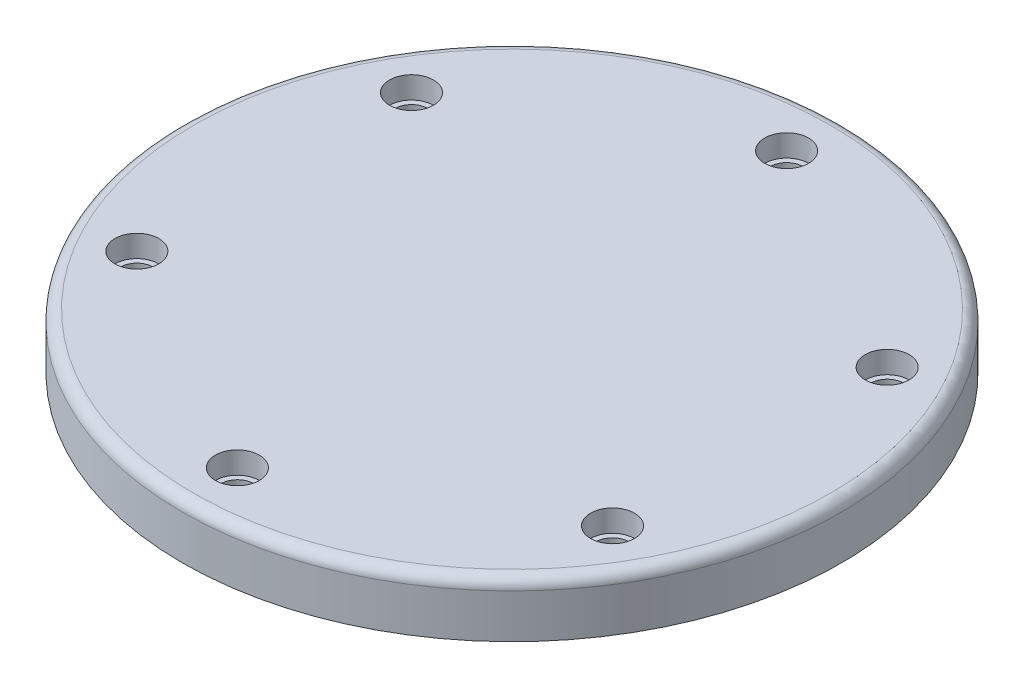
ISO-10303-21;
HEADER;
FILE_DESCRIPTION(('STEP AP214'),'2;1');
FILE_NAME('part.step','',(''),(''),'','','');
FILE_SCHEMA(('AUTOMOTIVE_DESIGN { 1 0 10303 214 1 1 1 1 }'));
ENDSEC;
DATA;
#1=APPLICATION_CONTEXT('core data for automotive mechanical design processes');
#2=APPLICATION_PROTOCOL_DEFINITION('international standard','automotive_design',2000,#1);
#3=PRODUCT_CONTEXT('',#1,'mechanical');
#4=PRODUCT('Part','Part','',(#3));
#5=PRODUCT_RELATED_PRODUCT_CATEGORY('part','',(#4));
#6=PRODUCT_DEFINITION_FORMATION('','',#4);
#7=PRODUCT_DEFINITION_CONTEXT('part definition',#1,'design');
#8=PRODUCT_DEFINITION('design','',#6,#7);
#9=PRODUCT_DEFINITION_SHAPE('','',#8);
#10=(LENGTH_UNIT() NAMED_UNIT(*) SI_UNIT(.MILLI.,.METRE.));
#11=(NAMED_UNIT(*) PLANE_ANGLE_UNIT() SI_UNIT($,.RADIAN.));
#12=(NAMED_UNIT(*) SI_UNIT($,.STERADIAN.) SOLID_ANGLE_UNIT());
#13=UNCERTAINTY_MEASURE_WITH_UNIT(LENGTH_MEASURE(1.E-05),#10,'distance_accuracy_value','');
#14=(GEOMETRIC_REPRESENTATION_CONTEXT(3) GLOBAL_UNCERTAINTY_ASSIGNED_CONTEXT((#13)) GLOBAL_UNIT_ASSIGNED_CONTEXT((#10,
#11,#12)) REPRESENTATION_CONTEXT('',''));
#15=CARTESIAN_POINT('',(0.,0.,0.));
#16=DIRECTION('',(0.,0.,1.));
#17=DIRECTION('',(1.,0.,0.));
#18=AXIS2_PLACEMENT_3D('',#15,#16,#17);
#19=CARTESIAN_POINT('',(0.,5.,-29.));
#20=DIRECTION('',(0.,1.,0.));
#21=DIRECTION('',(0.,0.,1.));
#22=AXIS2_PLACEMENT_3D('',#19,#20,#21);
#23=PLANE('',#22);
#24=CARTESIAN_POINT('',(21.6506350946108,5.,12.5000000000003));
#25=DIRECTION('',(0.,-1.,0.));
#26=DIRECTION('',(-0.866025403784433,0.,-0.50000000000001));
#27=AXIS2_PLACEMENT_3D('',#24,#25,#26);
#28=CIRCLE('',#27,2.);
#29=CARTESIAN_POINT('',(19.918584287042,5.,11.5000000000002));
#30=VERTEX_POINT('',#29);
#31=EDGE_CURVE('E120',#30,#30,#28,.T.);
#32=ORIENTED_EDGE('',*,*,#31,.T.);
#33=EDGE_LOOP('',(#32));
#34=FACE_BOUND('',#33,.T.);
#35=CARTESIAN_POINT('',(21.6506350946111,5.,-12.4999999999998));
#36=DIRECTION('',(0.,-1.,0.));
#37=DIRECTION('',(-0.866025403784443,0.,0.499999999999992));
#38=AXIS2_PLACEMENT_3D('',#35,#36,#37);
#39=CIRCLE('',#38,2.);
#40=CARTESIAN_POINT('',(19.9185842870422,5.,-11.4999999999998));
#41=VERTEX_POINT('',#40);
#42=EDGE_CURVE('E108',#41,#41,#39,.T.);
#43=ORIENTED_EDGE('',*,*,#42,.T.);
#44=EDGE_LOOP('',(#43));
#45=FACE_BOUND('',#44,.T.);
#46=CARTESIAN_POINT('',(0.,5.,-25.));
#47=DIRECTION('',(0.,-1.,0.));
#48=DIRECTION('',(0.,0.,1.));
#49=AXIS2_PLACEMENT_3D('',#46,#47,#48);
#50=CIRCLE('',#49,2.);
#51=CARTESIAN_POINT('',(0.,5.,-23.));
#52=VERTEX_POINT('',#51);
#53=EDGE_CURVE('E96',#52,#52,#50,.T.);
#54=ORIENTED_EDGE('',*,*,#53,.T.);
#55=EDGE_LOOP('',(#54));
#56=FACE_BOUND('',#55,.T.);
#57=CARTESIAN_POINT('',(-21.6506350946109,5.,-12.5000000000001));
#58=DIRECTION('',(0.,-1.,0.));
#59=DIRECTION('',(0.866025403784436,0.,0.500000000000004));
#60=AXIS2_PLACEMENT_3D('',#57,#58,#59);
#61=CIRCLE('',#60,2.);
#62=CARTESIAN_POINT('',(-19.918584287042,5.,-11.5000000000001));
#63=VERTEX_POINT('',#62);
#64=EDGE_CURVE('E84',#63,#63,#61,.T.);
#65=ORIENTED_EDGE('',*,*,#64,.T.);
#66=EDGE_LOOP('',(#65));
#67=FACE_BOUND('',#66,.T.);
#68=CARTESIAN_POINT('',(-21.650635094611,5.,12.5));
#69=DIRECTION('',(0.,-1.,0.));
#70=DIRECTION('',(0.86602540378444,0.,-0.499999999999998));
#71=AXIS2_PLACEMENT_3D('',#68,#69,#70);
#72=CIRCLE('',#71,2.);
#73=CARTESIAN_POINT('',(-19.9185842870421,5.,11.5));
#74=VERTEX_POINT('',#73);
#75=EDGE_CURVE('E72',#74,#74,#72,.T.);
#76=ORIENTED_EDGE('',*,*,#75,.T.);
#77=EDGE_LOOP('',(#76));
#78=FACE_BOUND('',#77,.T.);
#79=CARTESIAN_POINT('',(0.,5.,25.));
#80=DIRECTION('',(0.,-1.,0.));
#81=DIRECTION('',(0.,0.,-1.));
#82=AXIS2_PLACEMENT_3D('',#79,#80,#81);
#83=CIRCLE('',#82,2.);
#84=CARTESIAN_POINT('',(0.,5.,23.));
#85=VERTEX_POINT('',#84);
#86=EDGE_CURVE('E60',#85,#85,#83,.T.);
#87=ORIENTED_EDGE('',*,*,#86,.T.);
#88=EDGE_LOOP('',(#87));
#89=FACE_BOUND('',#88,.T.);
#90=CARTESIAN_POINT('',(0.,5.,0.));
#91=DIRECTION('',(0.,-1.,0.));
#92=DIRECTION('',(0.,0.,-1.));
#93=AXIS2_PLACEMENT_3D('',#90,#91,#92);
#94=CIRCLE('',#93,29.);
#95=CARTESIAN_POINT('',(0.,5.,-29.));
#96=VERTEX_POINT('',#95);
#97=EDGE_CURVE('E10',#96,#96,#94,.T.);
#98=ORIENTED_EDGE('',*,*,#97,.F.);
#99=EDGE_LOOP('',(#98));
#100=FACE_BOUND('',#99,.T.);
#101=ADVANCED_FACE('F35',(#34,#45,#56,#67,#78,#89,#100),#23,.T.);
#102=CARTESIAN_POINT('',(0.,4.,0.));
#103=DIRECTION('',(0.,-1.,0.));
#104=DIRECTION('',(0.,0.,-1.));
#105=AXIS2_PLACEMENT_3D('',#102,#103,#104);
#106=TOROIDAL_SURFACE('',#105,29.,1.);
#107=ORIENTED_EDGE('',*,*,#97,.T.);
#108=EDGE_LOOP('',(#107));
#109=FACE_BOUND('',#108,.T.);
#110=CARTESIAN_POINT('',(0.,4.,0.));
#111=DIRECTION('',(0.,-1.,0.));
#112=DIRECTION('',(0.,0.,-1.));
#113=AXIS2_PLACEMENT_3D('',#110,#111,#112);
#114=CIRCLE('',#113,30.);
#115=CARTESIAN_POINT('',(0.,4.,-30.));
#116=VERTEX_POINT('',#115);
#117=EDGE_CURVE('E41',#116,#116,#114,.T.);
#118=ORIENTED_EDGE('',*,*,#117,.F.);
#119=EDGE_LOOP('',(#118));
#120=FACE_BOUND('',#119,.T.);
#121=ADVANCED_FACE('F164',(#109,#120),#106,.T.);
#122=CARTESIAN_POINT('',(0.,0.,0.));
#123=DIRECTION('',(0.,-1.,0.));
#124=DIRECTION('',(0.,0.,-1.));
#125=AXIS2_PLACEMENT_3D('',#122,#123,#124);
#126=CYLINDRICAL_SURFACE('',#125,30.);
#127=ORIENTED_EDGE('',*,*,#117,.T.);
#128=EDGE_LOOP('',(#127));
#129=FACE_BOUND('',#128,.T.);
#130=CARTESIAN_POINT('',(0.,0.,0.));
#131=DIRECTION('',(0.,-1.,0.));
#132=DIRECTION('',(0.,0.,-1.));
#133=AXIS2_PLACEMENT_3D('',#130,#131,#132);
#134=CIRCLE('',#133,30.);
#135=CARTESIAN_POINT('',(0.,0.,-30.));
#136=VERTEX_POINT('',#135);
#137=EDGE_CURVE('E45',#136,#136,#134,.T.);
#138=ORIENTED_EDGE('',*,*,#137,.F.);
#139=EDGE_LOOP('',(#138));
#140=FACE_BOUND('',#139,.T.);
#141=ADVANCED_FACE('F149',(#129,#140),#126,.T.);
#142=CARTESIAN_POINT('',(0.,0.,0.));
#143=DIRECTION('',(0.,-1.,0.));
#144=DIRECTION('',(0.,0.,-1.));
#145=AXIS2_PLACEMENT_3D('',#142,#143,#144);
#146=PLANE('',#145);
#147=CARTESIAN_POINT('',(21.6506350946108,0.,12.5000000000003));
#148=DIRECTION('',(0.,-1.,0.));
#149=DIRECTION('',(-0.866025403784433,0.,-0.50000000000001));
#150=AXIS2_PLACEMENT_3D('',#147,#148,#149);
#151=CIRCLE('',#150,1.5);
#152=CARTESIAN_POINT('',(20.3515969889342,0.,11.7500000000002));
#153=VERTEX_POINT('',#152);
#154=EDGE_CURVE('E111',#153,#153,#151,.T.);
#155=ORIENTED_EDGE('',*,*,#154,.F.);
#156=EDGE_LOOP('',(#155));
#157=FACE_BOUND('',#156,.T.);
#158=CARTESIAN_POINT('',(21.6506350946111,0.,-12.4999999999998));
#159=DIRECTION('',(0.,-1.,0.));
#160=DIRECTION('',(-0.866025403784443,0.,0.499999999999992));
#161=AXIS2_PLACEMENT_3D('',#158,#159,#160);
#162=CIRCLE('',#161,1.5);
#163=CARTESIAN_POINT('',(20.3515969889344,0.,-11.7499999999998));
#164=VERTEX_POINT('',#163);
#165=EDGE_CURVE('E99',#164,#164,#162,.T.);
#166=ORIENTED_EDGE('',*,*,#165,.F.);
#167=EDGE_LOOP('',(#166));
#168=FACE_BOUND('',#167,.T.);
#169=CARTESIAN_POINT('',(0.,0.,-25.));
#170=DIRECTION('',(0.,-1.,0.));
#171=DIRECTION('',(0.,0.,1.));
#172=AXIS2_PLACEMENT_3D('',#169,#170,#171);
#173=CIRCLE('',#172,1.5);
#174=CARTESIAN_POINT('',(0.,0.,-23.5));
#175=VERTEX_POINT('',#174);
#176=EDGE_CURVE('E87',#175,#175,#173,.T.);
#177=ORIENTED_EDGE('',*,*,#176,.F.);
#178=EDGE_LOOP('',(#177));
#179=FACE_BOUND('',#178,.T.);
#180=CARTESIAN_POINT('',(-21.6506350946109,0.,-12.5000000000001));
#181=DIRECTION('',(0.,-1.,0.));
#182=DIRECTION('',(0.866025403784436,0.,0.500000000000004));
#183=AXIS2_PLACEMENT_3D('',#180,#181,#182);
#184=CIRCLE('',#183,1.5);
#185=CARTESIAN_POINT('',(-20.3515969889343,0.,-11.7500000000001));
#186=VERTEX_POINT('',#185);
#187=EDGE_CURVE('E75',#186,#186,#184,.T.);
#188=ORIENTED_EDGE('',*,*,#187,.F.);
#189=EDGE_LOOP('',(#188));
#190=FACE_BOUND('',#189,.T.);
#191=CARTESIAN_POINT('',(-21.650635094611,0.,12.5));
#192=DIRECTION('',(0.,-1.,0.));
#193=DIRECTION('',(0.86602540378444,0.,-0.499999999999998));
#194=AXIS2_PLACEMENT_3D('',#191,#192,#193);
#195=CIRCLE('',#194,1.5);
#196=CARTESIAN_POINT('',(-20.3515969889343,0.,11.75));
#197=VERTEX_POINT('',#196);
#198=EDGE_CURVE('E63',#197,#197,#195,.T.);
#199=ORIENTED_EDGE('',*,*,#198,.F.);
#200=EDGE_LOOP('',(#199));
#201=FACE_BOUND('',#200,.T.);
#202=CARTESIAN_POINT('',(0.,0.,25.));
#203=DIRECTION('',(0.,-1.,0.));
#204=DIRECTION('',(0.,0.,-1.));
#205=AXIS2_PLACEMENT_3D('',#202,#203,#204);
#206=CIRCLE('',#205,1.5);
#207=CARTESIAN_POINT('',(0.,0.,23.5));
#208=VERTEX_POINT('',#207);
#209=EDGE_CURVE('E49',#208,#208,#206,.T.);
#210=ORIENTED_EDGE('',*,*,#209,.F.);
#211=EDGE_LOOP('',(#210));
#212=FACE_BOUND('',#211,.T.);
#213=ORIENTED_EDGE('',*,*,#137,.T.);
#214=EDGE_LOOP('',(#213));
#215=FACE_BOUND('',#214,.T.);
#216=ADVANCED_FACE('F145',(#157,#168,#179,#190,#201,#212,#215),#146,.T.);
#217=CARTESIAN_POINT('',(0.,0.,25.));
#218=DIRECTION('',(0.,-1.,0.));
#219=DIRECTION('',(0.,0.,-1.));
#220=AXIS2_PLACEMENT_3D('',#217,#218,#219);
#221=CYLINDRICAL_SURFACE('',#220,1.5);
#222=CARTESIAN_POINT('',(0.,3.,25.));
#223=DIRECTION('',(0.,-1.,0.));
#224=DIRECTION('',(0.,0.,-1.));
#225=AXIS2_PLACEMENT_3D('',#222,#223,#224);
#226=CIRCLE('',#225,1.5);
#227=CARTESIAN_POINT('',(0.,3.,23.5));
#228=VERTEX_POINT('',#227);
#229=EDGE_CURVE('E54',#228,#228,#226,.T.);
#230=ORIENTED_EDGE('',*,*,#229,.F.);
#231=EDGE_LOOP('',(#230));
#232=FACE_BOUND('',#231,.T.);
#233=ORIENTED_EDGE('',*,*,#209,.T.);
#234=EDGE_LOOP('',(#233));
#235=FACE_BOUND('',#234,.T.);
#236=ADVANCED_FACE('F148',(#232,#235),#221,.F.);
#237=CARTESIAN_POINT('',(0.,3.,23.5));
#238=DIRECTION('',(0.,-1.,0.));
#239=DIRECTION('',(0.,0.,-1.));
#240=AXIS2_PLACEMENT_3D('',#237,#238,#239);
#241=PLANE('',#240);
#242=CARTESIAN_POINT('',(0.,3.,25.));
#243=DIRECTION('',(0.,-1.,0.));
#244=DIRECTION('',(0.,0.,-1.));
#245=AXIS2_PLACEMENT_3D('',#242,#243,#244);
#246=CIRCLE('',#245,2.);
#247=CARTESIAN_POINT('',(0.,3.,23.));
#248=VERTEX_POINT('',#247);
#249=EDGE_CURVE('E57',#248,#248,#246,.T.);
#250=ORIENTED_EDGE('',*,*,#249,.F.);
#251=EDGE_LOOP('',(#250));
#252=FACE_BOUND('',#251,.T.);
#253=ORIENTED_EDGE('',*,*,#229,.T.);
#254=EDGE_LOOP('',(#253));
#255=FACE_BOUND('',#254,.T.);
#256=ADVANCED_FACE('F192',(#252,#255),#241,.F.);
#257=CARTESIAN_POINT('',(0.,0.,25.));
#258=DIRECTION('',(0.,-1.,0.));
#259=DIRECTION('',(0.,0.,-1.));
#260=AXIS2_PLACEMENT_3D('',#257,#258,#259);
#261=CYLINDRICAL_SURFACE('',#260,2.);
#262=ORIENTED_EDGE('',*,*,#86,.F.);
#263=EDGE_LOOP('',(#262));
#264=FACE_BOUND('',#263,.T.);
#265=ORIENTED_EDGE('',*,*,#249,.T.);
#266=EDGE_LOOP('',(#265));
#267=FACE_BOUND('',#266,.T.);
#268=ADVANCED_FACE('F201',(#264,#267),#261,.F.);
#269=CARTESIAN_POINT('',(-21.650635094611,0.,12.5));
#270=DIRECTION('',(0.,-1.,0.));
#271=DIRECTION('',(0.86602540378444,0.,-0.499999999999998));
#272=AXIS2_PLACEMENT_3D('',#269,#270,#271);
#273=CYLINDRICAL_SURFACE('',#272,1.5);
#274=CARTESIAN_POINT('',(-21.650635094611,3.,12.5));
#275=DIRECTION('',(0.,-1.,0.));
#276=DIRECTION('',(0.86602540378444,0.,-0.499999999999998));
#277=AXIS2_PLACEMENT_3D('',#274,#275,#276);
#278=CIRCLE('',#277,1.5);
#279=CARTESIAN_POINT('',(-20.3515969889343,3.,11.75));
#280=VERTEX_POINT('',#279);
#281=EDGE_CURVE('E66',#280,#280,#278,.T.);
#282=ORIENTED_EDGE('',*,*,#281,.F.);
#283=EDGE_LOOP('',(#282));
#284=FACE_BOUND('',#283,.T.);
#285=ORIENTED_EDGE('',*,*,#198,.T.);
#286=EDGE_LOOP('',(#285));
#287=FACE_BOUND('',#286,.T.);
#288=ADVANCED_FACE('F210',(#284,#287),#273,.F.);
#289=CARTESIAN_POINT('',(-20.3515969889343,3.,11.75));
#290=DIRECTION('',(0.,-1.,0.));
#291=DIRECTION('',(0.86602540378444,0.,-0.499999999999998));
#292=AXIS2_PLACEMENT_3D('',#289,#290,#291);
#293=PLANE('',#292);
#294=CARTESIAN_POINT('',(-21.650635094611,3.,12.5));
#295=DIRECTION('',(0.,-1.,0.));
#296=DIRECTION('',(0.86602540378444,0.,-0.499999999999998));
#297=AXIS2_PLACEMENT_3D('',#294,#295,#296);
#298=CIRCLE('',#297,2.);
#299=CARTESIAN_POINT('',(-19.9185842870421,3.,11.5));
#300=VERTEX_POINT('',#299);
#301=EDGE_CURVE('E69',#300,#300,#298,.T.);
#302=ORIENTED_EDGE('',*,*,#301,.F.);
#303=EDGE_LOOP('',(#302));
#304=FACE_BOUND('',#303,.T.);
#305=ORIENTED_EDGE('',*,*,#281,.T.);
#306=EDGE_LOOP('',(#305));
#307=FACE_BOUND('',#306,.T.);
#308=ADVANCED_FACE('F221',(#304,#307),#293,.F.);
#309=CARTESIAN_POINT('',(-21.650635094611,0.,12.5));
#310=DIRECTION('',(0.,-1.,0.));
#311=DIRECTION('',(0.86602540378444,0.,-0.499999999999998));
#312=AXIS2_PLACEMENT_3D('',#309,#310,#311);
#313=CYLINDRICAL_SURFACE('',#312,2.);
#314=ORIENTED_EDGE('',*,*,#75,.F.);
#315=EDGE_LOOP('',(#314));
#316=FACE_BOUND('',#315,.T.);
#317=ORIENTED_EDGE('',*,*,#301,.T.);
#318=EDGE_LOOP('',(#317));
#319=FACE_BOUND('',#318,.T.);
#320=ADVANCED_FACE('F228',(#316,#319),#313,.F.);
#321=CARTESIAN_POINT('',(-21.6506350946109,0.,-12.5000000000001));
#322=DIRECTION('',(0.,-1.,0.));
#323=DIRECTION('',(0.866025403784436,0.,0.500000000000004));
#324=AXIS2_PLACEMENT_3D('',#321,#322,#323);
#325=CYLINDRICAL_SURFACE('',#324,1.5);
#326=CARTESIAN_POINT('',(-21.6506350946109,3.,-12.5000000000001));
#327=DIRECTION('',(0.,-1.,0.));
#328=DIRECTION('',(0.866025403784436,0.,0.500000000000004));
#329=AXIS2_PLACEMENT_3D('',#326,#327,#328);
#330=CIRCLE('',#329,1.5);
#331=CARTESIAN_POINT('',(-20.3515969889343,3.,-11.7500000000001));
#332=VERTEX_POINT('',#331);
#333=EDGE_CURVE('E78',#332,#332,#330,.T.);
#334=ORIENTED_EDGE('',*,*,#333,.F.);
#335=EDGE_LOOP('',(#334));
#336=FACE_BOUND('',#335,.T.);
#337=ORIENTED_EDGE('',*,*,#187,.T.);
#338=EDGE_LOOP('',(#337));
#339=FACE_BOUND('',#338,.T.);
#340=ADVANCED_FACE('F236',(#336,#339),#325,.F.);
#341=CARTESIAN_POINT('',(-20.3515969889343,3.,-11.7500000000001));
#342=DIRECTION('',(0.,-1.,0.));
#343=DIRECTION('',(0.866025403784436,0.,0.500000000000004));
#344=AXIS2_PLACEMENT_3D('',#341,#342,#343);
#345=PLANE('',#344);
#346=CARTESIAN_POINT('',(-21.6506350946109,3.,-12.5000000000001));
#347=DIRECTION('',(0.,-1.,0.));
#348=DIRECTION('',(0.866025403784436,0.,0.500000000000004));
#349=AXIS2_PLACEMENT_3D('',#346,#347,#348);
#350=CIRCLE('',#349,2.);
#351=CARTESIAN_POINT('',(-19.918584287042,3.,-11.5000000000001));
#352=VERTEX_POINT('',#351);
#353=EDGE_CURVE('E81',#352,#352,#350,.T.);
#354=ORIENTED_EDGE('',*,*,#353,.F.);
#355=EDGE_LOOP('',(#354));
#356=FACE_BOUND('',#355,.T.);
#357=ORIENTED_EDGE('',*,*,#333,.T.);
#358=EDGE_LOOP('',(#357));
#359=FACE_BOUND('',#358,.T.);
#360=ADVANCED_FACE('F244',(#356,#359),#345,.F.);
#361=CARTESIAN_POINT('',(-21.6506350946109,0.,-12.5000000000001));
#362=DIRECTION('',(0.,-1.,0.));
#363=DIRECTION('',(0.866025403784436,0.,0.500000000000004));
#364=AXIS2_PLACEMENT_3D('',#361,#362,#363);
#365=CYLINDRICAL_SURFACE('',#364,2.);
#366=ORIENTED_EDGE('',*,*,#64,.F.);
#367=EDGE_LOOP('',(#366));
#368=FACE_BOUND('',#367,.T.);
#369=ORIENTED_EDGE('',*,*,#353,.T.);
#370=EDGE_LOOP('',(#369));
#371=FACE_BOUND('',#370,.T.);
#372=ADVANCED_FACE('F252',(#368,#371),#365,.F.);
#373=CARTESIAN_POINT('',(0.,0.,-25.));
#374=DIRECTION('',(0.,-1.,0.));
#375=DIRECTION('',(0.,0.,1.));
#376=AXIS2_PLACEMENT_3D('',#373,#374,#375);
#377=CYLINDRICAL_SURFACE('',#376,1.5);
#378=CARTESIAN_POINT('',(0.,3.,-25.));
#379=DIRECTION('',(0.,-1.,0.));
#380=DIRECTION('',(0.,0.,1.));
#381=AXIS2_PLACEMENT_3D('',#378,#379,#380);
#382=CIRCLE('',#381,1.5);
#383=CARTESIAN_POINT('',(0.,3.,-23.5));
#384=VERTEX_POINT('',#383);
#385=EDGE_CURVE('E90',#384,#384,#382,.T.);
#386=ORIENTED_EDGE('',*,*,#385,.F.);
#387=EDGE_LOOP('',(#386));
#388=FACE_BOUND('',#387,.T.);
#389=ORIENTED_EDGE('',*,*,#176,.T.);
#390=EDGE_LOOP('',(#389));
#391=FACE_BOUND('',#390,.T.);
#392=ADVANCED_FACE('F260',(#388,#391),#377,.F.);
#393=CARTESIAN_POINT('',(0.,3.,-23.5));
#394=DIRECTION('',(0.,-1.,0.));
#395=DIRECTION('',(0.,0.,1.));
#396=AXIS2_PLACEMENT_3D('',#393,#394,#395);
#397=PLANE('',#396);
#398=CARTESIAN_POINT('',(0.,3.,-25.));
#399=DIRECTION('',(0.,-1.,0.));
#400=DIRECTION('',(0.,0.,1.));
#401=AXIS2_PLACEMENT_3D('',#398,#399,#400);
#402=CIRCLE('',#401,2.);
#403=CARTESIAN_POINT('',(0.,3.,-23.));
#404=VERTEX_POINT('',#403);
#405=EDGE_CURVE('E93',#404,#404,#402,.T.);
#406=ORIENTED_EDGE('',*,*,#405,.F.);
#407=EDGE_LOOP('',(#406));
#408=FACE_BOUND('',#407,.T.);
#409=ORIENTED_EDGE('',*,*,#385,.T.);
#410=EDGE_LOOP('',(#409));
#411=FACE_BOUND('',#410,.T.);
#412=ADVANCED_FACE('F268',(#408,#411),#397,.F.);
#413=CARTESIAN_POINT('',(0.,0.,-25.));
#414=DIRECTION('',(0.,-1.,0.));
#415=DIRECTION('',(0.,0.,1.));
#416=AXIS2_PLACEMENT_3D('',#413,#414,#415);
#417=CYLINDRICAL_SURFACE('',#416,2.);
#418=ORIENTED_EDGE('',*,*,#53,.F.);
#419=EDGE_LOOP('',(#418));
#420=FACE_BOUND('',#419,.T.);
#421=ORIENTED_EDGE('',*,*,#405,.T.);
#422=EDGE_LOOP('',(#421));
#423=FACE_BOUND('',#422,.T.);
#424=ADVANCED_FACE('F276',(#420,#423),#417,.F.);
#425=CARTESIAN_POINT('',(21.6506350946111,0.,-12.4999999999998));
#426=DIRECTION('',(0.,-1.,0.));
#427=DIRECTION('',(-0.866025403784443,0.,0.499999999999992));
#428=AXIS2_PLACEMENT_3D('',#425,#426,#427);
#429=CYLINDRICAL_SURFACE('',#428,1.5);
#430=CARTESIAN_POINT('',(21.6506350946111,3.,-12.4999999999998));
#431=DIRECTION('',(0.,-1.,0.));
#432=DIRECTION('',(-0.866025403784443,0.,0.499999999999992));
#433=AXIS2_PLACEMENT_3D('',#430,#431,#432);
#434=CIRCLE('',#433,1.5);
#435=CARTESIAN_POINT('',(20.3515969889344,3.,-11.7499999999998));
#436=VERTEX_POINT('',#435);
#437=EDGE_CURVE('E102',#436,#436,#434,.T.);
#438=ORIENTED_EDGE('',*,*,#437,.F.);
#439=EDGE_LOOP('',(#438));
#440=FACE_BOUND('',#439,.T.);
#441=ORIENTED_EDGE('',*,*,#165,.T.);
#442=EDGE_LOOP('',(#441));
#443=FACE_BOUND('',#442,.T.);
#444=ADVANCED_FACE('F284',(#440,#443),#429,.F.);
#445=CARTESIAN_POINT('',(20.3515969889344,3.,-11.7499999999998));
#446=DIRECTION('',(0.,-1.,0.));
#447=DIRECTION('',(-0.866025403784443,0.,0.499999999999992));
#448=AXIS2_PLACEMENT_3D('',#445,#446,#447);
#449=PLANE('',#448);
#450=CARTESIAN_POINT('',(21.6506350946111,3.,-12.4999999999998));
#451=DIRECTION('',(0.,-1.,0.));
#452=DIRECTION('',(-0.866025403784443,0.,0.499999999999992));
#453=AXIS2_PLACEMENT_3D('',#450,#451,#452);
#454=CIRCLE('',#453,2.);
#455=CARTESIAN_POINT('',(19.9185842870422,3.,-11.4999999999998));
#456=VERTEX_POINT('',#455);
#457=EDGE_CURVE('E105',#456,#456,#454,.T.);
#458=ORIENTED_EDGE('',*,*,#457,.F.);
#459=EDGE_LOOP('',(#458));
#460=FACE_BOUND('',#459,.T.);
#461=ORIENTED_EDGE('',*,*,#437,.T.);
#462=EDGE_LOOP('',(#461));
#463=FACE_BOUND('',#462,.T.);
#464=ADVANCED_FACE('F292',(#460,#463),#449,.F.);
#465=CARTESIAN_POINT('',(21.6506350946111,0.,-12.4999999999998));
#466=DIRECTION('',(0.,-1.,0.));
#467=DIRECTION('',(-0.866025403784443,0.,0.499999999999992));
#468=AXIS2_PLACEMENT_3D('',#465,#466,#467);
#469=CYLINDRICAL_SURFACE('',#468,2.);
#470=ORIENTED_EDGE('',*,*,#42,.F.);
#471=EDGE_LOOP('',(#470));
#472=FACE_BOUND('',#471,.T.);
#473=ORIENTED_EDGE('',*,*,#457,.T.);
#474=EDGE_LOOP('',(#473));
#475=FACE_BOUND('',#474,.T.);
#476=ADVANCED_FACE('F141',(#472,#475),#469,.F.);
#477=CARTESIAN_POINT('',(21.6506350946108,0.,12.5000000000003));
#478=DIRECTION('',(0.,-1.,0.));
#479=DIRECTION('',(-0.866025403784433,0.,-0.50000000000001));
#480=AXIS2_PLACEMENT_3D('',#477,#478,#479);
#481=CYLINDRICAL_SURFACE('',#480,1.5);
#482=CARTESIAN_POINT('',(21.6506350946108,3.,12.5000000000003));
#483=DIRECTION('',(0.,-1.,0.));
#484=DIRECTION('',(-0.866025403784433,0.,-0.50000000000001));
#485=AXIS2_PLACEMENT_3D('',#482,#483,#484);
#486=CIRCLE('',#485,1.5);
#487=CARTESIAN_POINT('',(20.3515969889342,3.,11.7500000000002));
#488=VERTEX_POINT('',#487);
#489=EDGE_CURVE('E114',#488,#488,#486,.T.);
#490=ORIENTED_EDGE('',*,*,#489,.F.);
#491=EDGE_LOOP('',(#490));
#492=FACE_BOUND('',#491,.T.);
#493=ORIENTED_EDGE('',*,*,#154,.T.);
#494=EDGE_LOOP('',(#493));
#495=FACE_BOUND('',#494,.T.);
#496=ADVANCED_FACE('F135',(#492,#495),#481,.F.);
#497=CARTESIAN_POINT('',(20.3515969889342,3.,11.7500000000002));
#498=DIRECTION('',(0.,-1.,0.));
#499=DIRECTION('',(-0.866025403784433,0.,-0.50000000000001));
#500=AXIS2_PLACEMENT_3D('',#497,#498,#499);
#501=PLANE('',#500);
#502=CARTESIAN_POINT('',(21.6506350946108,3.,12.5000000000003));
#503=DIRECTION('',(0.,-1.,0.));
#504=DIRECTION('',(-0.866025403784433,0.,-0.50000000000001));
#505=AXIS2_PLACEMENT_3D('',#502,#503,#504);
#506=CIRCLE('',#505,2.);
#507=CARTESIAN_POINT('',(19.918584287042,3.,11.5000000000002));
#508=VERTEX_POINT('',#507);
#509=EDGE_CURVE('E117',#508,#508,#506,.T.);
#510=ORIENTED_EDGE('',*,*,#509,.F.);
#511=EDGE_LOOP('',(#510));
#512=FACE_BOUND('',#511,.T.);
#513=ORIENTED_EDGE('',*,*,#489,.T.);
#514=EDGE_LOOP('',(#513));
#515=FACE_BOUND('',#514,.T.);
#516=ADVANCED_FACE('F129',(#512,#515),#501,.F.);
#517=CARTESIAN_POINT('',(21.6506350946108,0.,12.5000000000003));
#518=DIRECTION('',(0.,-1.,0.));
#519=DIRECTION('',(-0.866025403784433,0.,-0.50000000000001));
#520=AXIS2_PLACEMENT_3D('',#517,#518,#519);
#521=CYLINDRICAL_SURFACE('',#520,2.);
#522=ORIENTED_EDGE('',*,*,#31,.F.);
#523=EDGE_LOOP('',(#522));
#524=FACE_BOUND('',#523,.T.);
#525=ORIENTED_EDGE('',*,*,#509,.T.);
#526=EDGE_LOOP('',(#525));
#527=FACE_BOUND('',#526,.T.);
#528=ADVANCED_FACE('F126',(#524,#527),#521,.F.);
#529=CLOSED_SHELL('',(#101,#121,#141,#216,#236,#256,#268,#288,#308,#320,#340,#360,#372,#392,
#412,#424,#444,#464,#476,#496,#516,#528));
#530=MANIFOLD_SOLID_BREP('B2',#529);
#531=ADVANCED_BREP_SHAPE_REPRESENTATION('',(#18,#530),#14);
#532=SHAPE_DEFINITION_REPRESENTATION(#9,#531);
ENDSEC;
END-ISO-10303-21;
